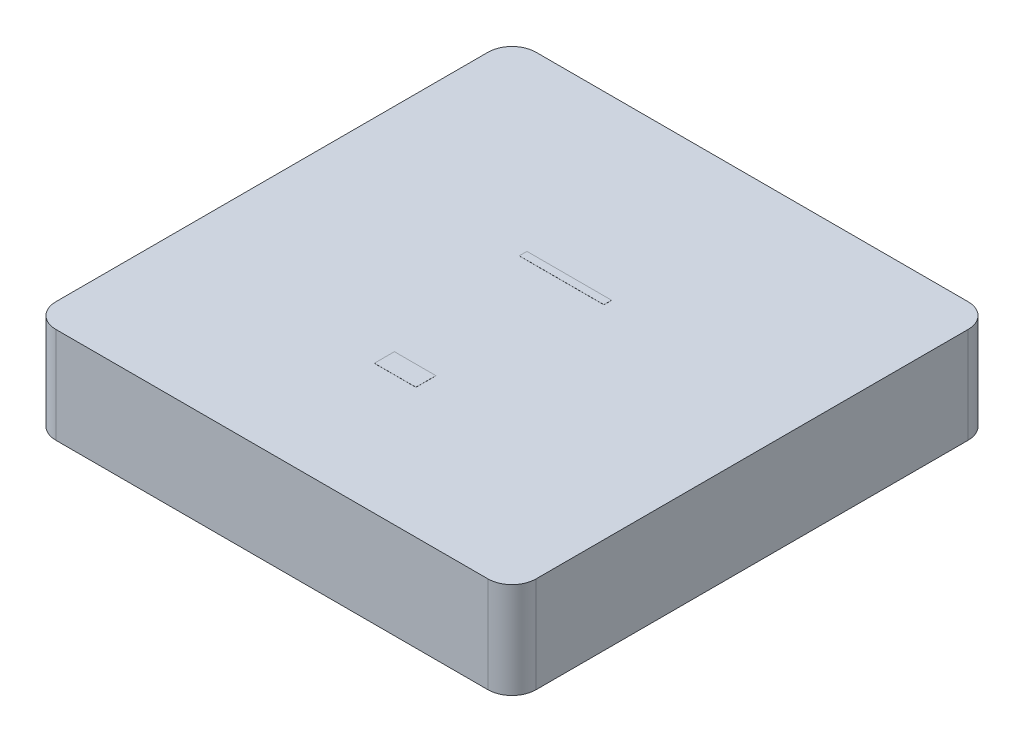
ISO-10303-21;
HEADER;
FILE_DESCRIPTION(('STEP AP214'),'2;1');
FILE_NAME('part.step','',(''),(''),'','','');
FILE_SCHEMA(('AUTOMOTIVE_DESIGN { 1 0 10303 214 1 1 1 1 }'));
ENDSEC;
DATA;
#1=APPLICATION_CONTEXT('core data for automotive mechanical design processes');
#2=APPLICATION_PROTOCOL_DEFINITION('international standard','automotive_design',2000,#1);
#3=PRODUCT_CONTEXT('',#1,'mechanical');
#4=PRODUCT('Part','Part','',(#3));
#5=PRODUCT_RELATED_PRODUCT_CATEGORY('part','',(#4));
#6=PRODUCT_DEFINITION_FORMATION('','',#4);
#7=PRODUCT_DEFINITION_CONTEXT('part definition',#1,'design');
#8=PRODUCT_DEFINITION('design','',#6,#7);
#9=PRODUCT_DEFINITION_SHAPE('','',#8);
#10=(LENGTH_UNIT() NAMED_UNIT(*) SI_UNIT(.MILLI.,.METRE.));
#11=(NAMED_UNIT(*) PLANE_ANGLE_UNIT() SI_UNIT($,.RADIAN.));
#12=(NAMED_UNIT(*) SI_UNIT($,.STERADIAN.) SOLID_ANGLE_UNIT());
#13=UNCERTAINTY_MEASURE_WITH_UNIT(LENGTH_MEASURE(1.E-05),#10,'distance_accuracy_value','');
#14=(GEOMETRIC_REPRESENTATION_CONTEXT(3) GLOBAL_UNCERTAINTY_ASSIGNED_CONTEXT((#13)) GLOBAL_UNIT_ASSIGNED_CONTEXT((#10,
#11,#12)) REPRESENTATION_CONTEXT('',''));
#15=CARTESIAN_POINT('',(0.,0.,0.));
#16=DIRECTION('',(0.,0.,1.));
#17=DIRECTION('',(1.,0.,0.));
#18=AXIS2_PLACEMENT_3D('',#15,#16,#17);
#19=CARTESIAN_POINT('',(0.,2.54,-12.7));
#20=DIRECTION('',(1.,0.,0.));
#21=DIRECTION('',(0.,0.,-1.));
#22=AXIS2_PLACEMENT_3D('',#19,#20,#21);
#23=PLANE('',#22);
#24=DIRECTION('',(0.,0.,1.));
#25=VECTOR('',#24,1.);
#26=CARTESIAN_POINT('',(0.,2.54,-12.7));
#27=LINE('',#26,#25);
#28=CARTESIAN_POINT('',(0.,2.54,-12.065));
#29=VERTEX_POINT('',#28);
#30=CARTESIAN_POINT('',(0.,2.54,-0.635));
#31=VERTEX_POINT('',#30);
#32=EDGE_CURVE('E279',#29,#31,#27,.T.);
#33=ORIENTED_EDGE('',*,*,#32,.F.);
#34=DIRECTION('',(0.,-1.,0.));
#35=VECTOR('',#34,1.);
#36=CARTESIAN_POINT('',(0.,2.54,-12.065));
#37=LINE('',#36,#35);
#38=CARTESIAN_POINT('',(0.,0.,-12.065));
#39=VERTEX_POINT('',#38);
#40=EDGE_CURVE('E304',#29,#39,#37,.T.);
#41=ORIENTED_EDGE('',*,*,#40,.T.);
#42=DIRECTION('',(0.,0.,1.));
#43=VECTOR('',#42,1.);
#44=CARTESIAN_POINT('',(0.,0.,-12.7));
#45=LINE('',#44,#43);
#46=CARTESIAN_POINT('',(0.,0.,-0.635));
#47=VERTEX_POINT('',#46);
#48=EDGE_CURVE('E259',#39,#47,#45,.T.);
#49=ORIENTED_EDGE('',*,*,#48,.T.);
#50=DIRECTION('',(0.,-1.,0.));
#51=VECTOR('',#50,1.);
#52=CARTESIAN_POINT('',(0.,2.54,-0.635));
#53=LINE('',#52,#51);
#54=EDGE_CURVE('E292',#47,#31,#53,.F.);
#55=ORIENTED_EDGE('',*,*,#54,.T.);
#56=EDGE_LOOP('',(#33,#41,#49,#55));
#57=FACE_BOUND('',#56,.T.);
#58=ADVANCED_FACE('F33',(#57),#23,.F.);
#59=CARTESIAN_POINT('',(0.,2.54,0.));
#60=DIRECTION('',(0.,0.,-1.));
#61=DIRECTION('',(-1.,0.,0.));
#62=AXIS2_PLACEMENT_3D('',#59,#60,#61);
#63=PLANE('',#62);
#64=DIRECTION('',(1.,0.,0.));
#65=VECTOR('',#64,1.);
#66=CARTESIAN_POINT('',(0.,0.,0.));
#67=LINE('',#66,#65);
#68=CARTESIAN_POINT('',(0.635,0.,0.));
#69=VERTEX_POINT('',#68);
#70=CARTESIAN_POINT('',(12.065,0.,0.));
#71=VERTEX_POINT('',#70);
#72=EDGE_CURVE('E295',#69,#71,#67,.T.);
#73=ORIENTED_EDGE('',*,*,#72,.T.);
#74=DIRECTION('',(0.,-1.,0.));
#75=VECTOR('',#74,1.);
#76=CARTESIAN_POINT('',(12.065,2.54,0.));
#77=LINE('',#76,#75);
#78=CARTESIAN_POINT('',(12.065,2.54,0.));
#79=VERTEX_POINT('',#78);
#80=EDGE_CURVE('E41',#71,#79,#77,.F.);
#81=ORIENTED_EDGE('',*,*,#80,.T.);
#82=DIRECTION('',(1.,0.,0.));
#83=VECTOR('',#82,1.);
#84=CARTESIAN_POINT('',(0.,2.54,0.));
#85=LINE('',#84,#83);
#86=CARTESIAN_POINT('',(0.635,2.54,0.));
#87=VERTEX_POINT('',#86);
#88=EDGE_CURVE('E282',#87,#79,#85,.T.);
#89=ORIENTED_EDGE('',*,*,#88,.F.);
#90=DIRECTION('',(0.,-1.,0.));
#91=VECTOR('',#90,1.);
#92=CARTESIAN_POINT('',(0.635,2.54,0.));
#93=LINE('',#92,#91);
#94=EDGE_CURVE('E333',#87,#69,#93,.T.);
#95=ORIENTED_EDGE('',*,*,#94,.T.);
#96=EDGE_LOOP('',(#73,#81,#89,#95));
#97=FACE_BOUND('',#96,.T.);
#98=ADVANCED_FACE('F338',(#97),#63,.F.);
#99=CARTESIAN_POINT('',(12.7,2.54,0.));
#100=DIRECTION('',(-1.,0.,0.));
#101=DIRECTION('',(0.,0.,1.));
#102=AXIS2_PLACEMENT_3D('',#99,#100,#101);
#103=PLANE('',#102);
#104=DIRECTION('',(0.,0.,-1.));
#105=VECTOR('',#104,1.);
#106=CARTESIAN_POINT('',(12.7,0.,0.));
#107=LINE('',#106,#105);
#108=CARTESIAN_POINT('',(12.7,0.,-0.635));
#109=VERTEX_POINT('',#108);
#110=CARTESIAN_POINT('',(12.7,0.,-12.065));
#111=VERTEX_POINT('',#110);
#112=EDGE_CURVE('E298',#109,#111,#107,.T.);
#113=ORIENTED_EDGE('',*,*,#112,.T.);
#114=DIRECTION('',(0.,-1.,0.));
#115=VECTOR('',#114,1.);
#116=CARTESIAN_POINT('',(12.7,2.54,-12.065));
#117=LINE('',#116,#115);
#118=CARTESIAN_POINT('',(12.7,2.54,-12.065));
#119=VERTEX_POINT('',#118);
#120=EDGE_CURVE('E331',#111,#119,#117,.F.);
#121=ORIENTED_EDGE('',*,*,#120,.T.);
#122=DIRECTION('',(0.,0.,-1.));
#123=VECTOR('',#122,1.);
#124=CARTESIAN_POINT('',(12.7,2.54,0.));
#125=LINE('',#124,#123);
#126=CARTESIAN_POINT('',(12.7,2.54,-0.635));
#127=VERTEX_POINT('',#126);
#128=EDGE_CURVE('E286',#127,#119,#125,.T.);
#129=ORIENTED_EDGE('',*,*,#128,.F.);
#130=DIRECTION('',(0.,-1.,0.));
#131=VECTOR('',#130,1.);
#132=CARTESIAN_POINT('',(12.7,2.54,-0.635));
#133=LINE('',#132,#131);
#134=EDGE_CURVE('E328',#127,#109,#133,.T.);
#135=ORIENTED_EDGE('',*,*,#134,.T.);
#136=EDGE_LOOP('',(#113,#121,#129,#135));
#137=FACE_BOUND('',#136,.T.);
#138=ADVANCED_FACE('F351',(#137),#103,.F.);
#139=CARTESIAN_POINT('',(12.7,2.54,-12.7));
#140=DIRECTION('',(0.,0.,1.));
#141=DIRECTION('',(1.,0.,0.));
#142=AXIS2_PLACEMENT_3D('',#139,#140,#141);
#143=PLANE('',#142);
#144=DIRECTION('',(-1.,0.,0.));
#145=VECTOR('',#144,1.);
#146=CARTESIAN_POINT('',(12.7,0.,-12.7));
#147=LINE('',#146,#145);
#148=CARTESIAN_POINT('',(12.065,0.,-12.7));
#149=VERTEX_POINT('',#148);
#150=CARTESIAN_POINT('',(0.634999999999995,0.,-12.7));
#151=VERTEX_POINT('',#150);
#152=EDGE_CURVE('E283',#149,#151,#147,.T.);
#153=ORIENTED_EDGE('',*,*,#152,.T.);
#154=DIRECTION('',(0.,-1.,0.));
#155=VECTOR('',#154,1.);
#156=CARTESIAN_POINT('',(0.634999999999995,2.54,-12.7));
#157=LINE('',#156,#155);
#158=CARTESIAN_POINT('',(0.634999999999995,2.54,-12.7));
#159=VERTEX_POINT('',#158);
#160=EDGE_CURVE('E318',#151,#159,#157,.F.);
#161=ORIENTED_EDGE('',*,*,#160,.T.);
#162=DIRECTION('',(-1.,0.,0.));
#163=VECTOR('',#162,1.);
#164=CARTESIAN_POINT('',(12.7,2.54,-12.7));
#165=LINE('',#164,#163);
#166=CARTESIAN_POINT('',(12.065,2.54,-12.7));
#167=VERTEX_POINT('',#166);
#168=EDGE_CURVE('E289',#167,#159,#165,.T.);
#169=ORIENTED_EDGE('',*,*,#168,.F.);
#170=DIRECTION('',(0.,-1.,0.));
#171=VECTOR('',#170,1.);
#172=CARTESIAN_POINT('',(12.065,2.54,-12.7));
#173=LINE('',#172,#171);
#174=EDGE_CURVE('E315',#167,#149,#173,.T.);
#175=ORIENTED_EDGE('',*,*,#174,.T.);
#176=EDGE_LOOP('',(#153,#161,#169,#175));
#177=FACE_BOUND('',#176,.T.);
#178=ADVANCED_FACE('F363',(#177),#143,.F.);
#179=CARTESIAN_POINT('',(0.,2.54,0.));
#180=DIRECTION('',(0.,1.,0.));
#181=DIRECTION('',(0.,0.,1.));
#182=AXIS2_PLACEMENT_3D('',#179,#180,#181);
#183=PLANE('',#182);
#184=DIRECTION('',(0.,0.,-1.));
#185=VECTOR('',#184,1.);
#186=CARTESIAN_POINT('',(5.07999999999999,2.54,-7.81212820512821));
#187=LINE('',#186,#185);
#188=CARTESIAN_POINT('',(5.07999999999999,2.54,-7.81212820512821));
#189=VERTEX_POINT('',#188);
#190=CARTESIAN_POINT('',(5.07999999999999,2.54,-8.01565384615385));
#191=VERTEX_POINT('',#190);
#192=EDGE_CURVE('E199',#189,#191,#187,.T.);
#193=ORIENTED_EDGE('',*,*,#192,.T.);
#194=DIRECTION('',(1.,0.,0.));
#195=VECTOR('',#194,1.);
#196=CARTESIAN_POINT('',(5.07999999999999,2.54,-8.01565384615385));
#197=LINE('',#196,#195);
#198=CARTESIAN_POINT('',(7.31878205128205,2.54,-8.01565384615385));
#199=VERTEX_POINT('',#198);
#200=EDGE_CURVE('E175',#191,#199,#197,.T.);
#201=ORIENTED_EDGE('',*,*,#200,.T.);
#202=DIRECTION('',(0.,0.,1.));
#203=VECTOR('',#202,1.);
#204=CARTESIAN_POINT('',(7.31878205128205,2.54,-8.01565384615385));
#205=LINE('',#204,#203);
#206=CARTESIAN_POINT('',(7.31878205128205,2.54,-7.81212820512821));
#207=VERTEX_POINT('',#206);
#208=EDGE_CURVE('E53',#199,#207,#205,.T.);
#209=ORIENTED_EDGE('',*,*,#208,.T.);
#210=DIRECTION('',(-1.,0.,0.));
#211=VECTOR('',#210,1.);
#212=CARTESIAN_POINT('',(7.31878205128205,2.54,-7.81212820512821));
#213=LINE('',#212,#211);
#214=EDGE_CURVE('E48',#207,#189,#213,.T.);
#215=ORIENTED_EDGE('',*,*,#214,.T.);
#216=EDGE_LOOP('',(#193,#201,#209,#215));
#217=FACE_BOUND('',#216,.T.);
#218=DIRECTION('',(0.,0.,-1.));
#219=VECTOR('',#218,1.);
#220=CARTESIAN_POINT('',(5.62414615384615,2.54,-3.43551282051282));
#221=LINE('',#220,#219);
#222=CARTESIAN_POINT('',(5.62414615384615,2.54,-3.43551282051282));
#223=VERTEX_POINT('',#222);
#224=CARTESIAN_POINT('',(5.62414615384615,2.54,-3.96467948717949));
#225=VERTEX_POINT('',#224);
#226=EDGE_CURVE('E204',#223,#225,#221,.T.);
#227=ORIENTED_EDGE('',*,*,#226,.T.);
#228=DIRECTION('',(1.,0.,0.));
#229=VECTOR('',#228,1.);
#230=CARTESIAN_POINT('',(5.62414615384615,2.54,-3.96467948717949));
#231=LINE('',#230,#229);
#232=CARTESIAN_POINT('',(6.72318461538461,2.54,-3.96467948717949));
#233=VERTEX_POINT('',#232);
#234=EDGE_CURVE('E223',#225,#233,#231,.T.);
#235=ORIENTED_EDGE('',*,*,#234,.T.);
#236=DIRECTION('',(0.,0.,1.));
#237=VECTOR('',#236,1.);
#238=CARTESIAN_POINT('',(6.72318461538461,2.54,-3.96467948717949));
#239=LINE('',#238,#237);
#240=CARTESIAN_POINT('',(6.72318461538461,2.54,-3.43551282051282));
#241=VERTEX_POINT('',#240);
#242=EDGE_CURVE('E225',#233,#241,#239,.T.);
#243=ORIENTED_EDGE('',*,*,#242,.T.);
#244=DIRECTION('',(-1.,0.,0.));
#245=VECTOR('',#244,1.);
#246=CARTESIAN_POINT('',(6.72318461538461,2.54,-3.43551282051282));
#247=LINE('',#246,#245);
#248=EDGE_CURVE('E212',#241,#223,#247,.T.);
#249=ORIENTED_EDGE('',*,*,#248,.T.);
#250=EDGE_LOOP('',(#227,#235,#243,#249));
#251=FACE_BOUND('',#250,.T.);
#252=ORIENTED_EDGE('',*,*,#168,.T.);
#253=CARTESIAN_POINT('',(0.634999999999995,2.54,-12.065));
#254=DIRECTION('',(0.,1.,0.));
#255=DIRECTION('',(0.,0.,1.));
#256=AXIS2_PLACEMENT_3D('',#253,#254,#255);
#257=CIRCLE('',#256,0.635);
#258=EDGE_CURVE('E326',#159,#29,#257,.T.);
#259=ORIENTED_EDGE('',*,*,#258,.T.);
#260=ORIENTED_EDGE('',*,*,#32,.T.);
#261=CARTESIAN_POINT('',(0.635,2.54,-0.635));
#262=DIRECTION('',(0.,1.,0.));
#263=DIRECTION('',(0.,0.,1.));
#264=AXIS2_PLACEMENT_3D('',#261,#262,#263);
#265=CIRCLE('',#264,0.635);
#266=EDGE_CURVE('E320',#31,#87,#265,.T.);
#267=ORIENTED_EDGE('',*,*,#266,.T.);
#268=ORIENTED_EDGE('',*,*,#88,.T.);
#269=CARTESIAN_POINT('',(12.065,2.54,-0.635));
#270=DIRECTION('',(0.,1.,0.));
#271=DIRECTION('',(0.,0.,1.));
#272=AXIS2_PLACEMENT_3D('',#269,#270,#271);
#273=CIRCLE('',#272,0.635);
#274=EDGE_CURVE('E322',#79,#127,#273,.T.);
#275=ORIENTED_EDGE('',*,*,#274,.T.);
#276=ORIENTED_EDGE('',*,*,#128,.T.);
#277=CARTESIAN_POINT('',(12.065,2.54,-12.065));
#278=DIRECTION('',(0.,1.,0.));
#279=DIRECTION('',(0.,0.,1.));
#280=AXIS2_PLACEMENT_3D('',#277,#278,#279);
#281=CIRCLE('',#280,0.635);
#282=EDGE_CURVE('E324',#119,#167,#281,.T.);
#283=ORIENTED_EDGE('',*,*,#282,.T.);
#284=EDGE_LOOP('',(#252,#259,#260,#267,#268,#275,#276,#283));
#285=FACE_BOUND('',#284,.T.);
#286=ADVANCED_FACE('F344',(#217,#251,#285),#183,.T.);
#287=CARTESIAN_POINT('',(0.,0.,0.));
#288=DIRECTION('',(0.,1.,0.));
#289=DIRECTION('',(0.,0.,1.));
#290=AXIS2_PLACEMENT_3D('',#287,#288,#289);
#291=PLANE('',#290);
#292=DIRECTION('',(-1.,0.,0.));
#293=VECTOR('',#292,1.);
#294=CARTESIAN_POINT('',(12.7,0.,-12.065));
#295=LINE('',#294,#293);
#296=CARTESIAN_POINT('',(12.065,0.,-12.065));
#297=VERTEX_POINT('',#296);
#298=CARTESIAN_POINT('',(0.634999999999995,0.,-12.065));
#299=VERTEX_POINT('',#298);
#300=EDGE_CURVE('E247',#297,#299,#295,.T.);
#301=ORIENTED_EDGE('',*,*,#300,.T.);
#302=DIRECTION('',(0.,0.,1.));
#303=VECTOR('',#302,1.);
#304=CARTESIAN_POINT('',(0.634999999999995,0.,-12.7));
#305=LINE('',#304,#303);
#306=CARTESIAN_POINT('',(0.635,0.,-0.635));
#307=VERTEX_POINT('',#306);
#308=EDGE_CURVE('E242',#299,#307,#305,.T.);
#309=ORIENTED_EDGE('',*,*,#308,.T.);
#310=DIRECTION('',(1.,0.,0.));
#311=VECTOR('',#310,1.);
#312=CARTESIAN_POINT('',(0.,0.,-0.635));
#313=LINE('',#312,#311);
#314=CARTESIAN_POINT('',(12.065,0.,-0.635));
#315=VERTEX_POINT('',#314);
#316=EDGE_CURVE('E271',#307,#315,#313,.T.);
#317=ORIENTED_EDGE('',*,*,#316,.T.);
#318=DIRECTION('',(0.,0.,-1.));
#319=VECTOR('',#318,1.);
#320=CARTESIAN_POINT('',(12.065,0.,0.));
#321=LINE('',#320,#319);
#322=EDGE_CURVE('E274',#315,#297,#321,.T.);
#323=ORIENTED_EDGE('',*,*,#322,.T.);
#324=EDGE_LOOP('',(#301,#309,#317,#323));
#325=FACE_BOUND('',#324,.T.);
#326=ORIENTED_EDGE('',*,*,#48,.F.);
#327=CARTESIAN_POINT('',(0.634999999999995,0.,-12.065));
#328=DIRECTION('',(0.,1.,0.));
#329=DIRECTION('',(0.,0.,1.));
#330=AXIS2_PLACEMENT_3D('',#327,#328,#329);
#331=CIRCLE('',#330,0.635);
#332=EDGE_CURVE('E313',#39,#151,#331,.F.);
#333=ORIENTED_EDGE('',*,*,#332,.T.);
#334=ORIENTED_EDGE('',*,*,#152,.F.);
#335=CARTESIAN_POINT('',(12.065,0.,-12.065));
#336=DIRECTION('',(0.,1.,0.));
#337=DIRECTION('',(0.,0.,1.));
#338=AXIS2_PLACEMENT_3D('',#335,#336,#337);
#339=CIRCLE('',#338,0.635);
#340=EDGE_CURVE('E311',#149,#111,#339,.F.);
#341=ORIENTED_EDGE('',*,*,#340,.T.);
#342=ORIENTED_EDGE('',*,*,#112,.F.);
#343=CARTESIAN_POINT('',(12.065,0.,-0.635));
#344=DIRECTION('',(0.,1.,0.));
#345=DIRECTION('',(0.,0.,1.));
#346=AXIS2_PLACEMENT_3D('',#343,#344,#345);
#347=CIRCLE('',#346,0.635);
#348=EDGE_CURVE('E309',#109,#71,#347,.F.);
#349=ORIENTED_EDGE('',*,*,#348,.T.);
#350=ORIENTED_EDGE('',*,*,#72,.F.);
#351=CARTESIAN_POINT('',(0.635,0.,-0.635));
#352=DIRECTION('',(0.,1.,0.));
#353=DIRECTION('',(0.,0.,1.));
#354=AXIS2_PLACEMENT_3D('',#351,#352,#353);
#355=CIRCLE('',#354,0.635);
#356=EDGE_CURVE('E307',#69,#47,#355,.F.);
#357=ORIENTED_EDGE('',*,*,#356,.T.);
#358=EDGE_LOOP('',(#326,#333,#334,#341,#342,#349,#350,#357));
#359=FACE_BOUND('',#358,.T.);
#360=ADVANCED_FACE('F355',(#325,#359),#291,.F.);
#361=CARTESIAN_POINT('',(0.634999999999995,2.54,-12.065));
#362=DIRECTION('',(0.,-1.,0.));
#363=DIRECTION('',(0.,0.,-1.));
#364=AXIS2_PLACEMENT_3D('',#361,#362,#363);
#365=CYLINDRICAL_SURFACE('',#364,0.635);
#366=ORIENTED_EDGE('',*,*,#258,.F.);
#367=ORIENTED_EDGE('',*,*,#160,.F.);
#368=ORIENTED_EDGE('',*,*,#332,.F.);
#369=ORIENTED_EDGE('',*,*,#40,.F.);
#370=EDGE_LOOP('',(#366,#367,#368,#369));
#371=FACE_BOUND('',#370,.T.);
#372=ADVANCED_FACE('F369',(#371),#365,.T.);
#373=CARTESIAN_POINT('',(12.065,2.54,-12.065));
#374=DIRECTION('',(0.,-1.,0.));
#375=DIRECTION('',(0.,0.,-1.));
#376=AXIS2_PLACEMENT_3D('',#373,#374,#375);
#377=CYLINDRICAL_SURFACE('',#376,0.635);
#378=ORIENTED_EDGE('',*,*,#282,.F.);
#379=ORIENTED_EDGE('',*,*,#120,.F.);
#380=ORIENTED_EDGE('',*,*,#340,.F.);
#381=ORIENTED_EDGE('',*,*,#174,.F.);
#382=EDGE_LOOP('',(#378,#379,#380,#381));
#383=FACE_BOUND('',#382,.T.);
#384=ADVANCED_FACE('F360',(#383),#377,.T.);
#385=CARTESIAN_POINT('',(12.065,2.54,-0.635));
#386=DIRECTION('',(0.,-1.,0.));
#387=DIRECTION('',(0.,0.,-1.));
#388=AXIS2_PLACEMENT_3D('',#385,#386,#387);
#389=CYLINDRICAL_SURFACE('',#388,0.635);
#390=ORIENTED_EDGE('',*,*,#274,.F.);
#391=ORIENTED_EDGE('',*,*,#80,.F.);
#392=ORIENTED_EDGE('',*,*,#348,.F.);
#393=ORIENTED_EDGE('',*,*,#134,.F.);
#394=EDGE_LOOP('',(#390,#391,#392,#393));
#395=FACE_BOUND('',#394,.T.);
#396=ADVANCED_FACE('F348',(#395),#389,.T.);
#397=CARTESIAN_POINT('',(0.635,2.54,-0.635));
#398=DIRECTION('',(0.,-1.,0.));
#399=DIRECTION('',(0.,0.,-1.));
#400=AXIS2_PLACEMENT_3D('',#397,#398,#399);
#401=CYLINDRICAL_SURFACE('',#400,0.635);
#402=ORIENTED_EDGE('',*,*,#266,.F.);
#403=ORIENTED_EDGE('',*,*,#54,.F.);
#404=ORIENTED_EDGE('',*,*,#356,.F.);
#405=ORIENTED_EDGE('',*,*,#94,.F.);
#406=EDGE_LOOP('',(#402,#403,#404,#405));
#407=FACE_BOUND('',#406,.T.);
#408=ADVANCED_FACE('F35',(#407),#401,.T.);
#409=CARTESIAN_POINT('',(0.634999999999995,2.54,-12.7));
#410=DIRECTION('',(1.,0.,0.));
#411=DIRECTION('',(0.,0.,-1.));
#412=AXIS2_PLACEMENT_3D('',#409,#410,#411);
#413=PLANE('',#412);
#414=DIRECTION('',(0.,0.,1.));
#415=VECTOR('',#414,1.);
#416=CARTESIAN_POINT('',(0.634999999999995,1.905,-12.7));
#417=LINE('',#416,#415);
#418=CARTESIAN_POINT('',(0.634999999999995,1.905,-12.065));
#419=VERTEX_POINT('',#418);
#420=CARTESIAN_POINT('',(0.635,1.905,-0.635));
#421=VERTEX_POINT('',#420);
#422=EDGE_CURVE('E243',#419,#421,#417,.T.);
#423=ORIENTED_EDGE('',*,*,#422,.T.);
#424=DIRECTION('',(0.,1.,0.));
#425=VECTOR('',#424,1.);
#426=CARTESIAN_POINT('',(0.635,2.54,-0.635));
#427=LINE('',#426,#425);
#428=EDGE_CURVE('E252',#307,#421,#427,.T.);
#429=ORIENTED_EDGE('',*,*,#428,.F.);
#430=ORIENTED_EDGE('',*,*,#308,.F.);
#431=DIRECTION('',(0.,1.,0.));
#432=VECTOR('',#431,1.);
#433=CARTESIAN_POINT('',(0.634999999999995,2.54,-12.065));
#434=LINE('',#433,#432);
#435=EDGE_CURVE('E248',#299,#419,#434,.T.);
#436=ORIENTED_EDGE('',*,*,#435,.T.);
#437=EDGE_LOOP('',(#423,#429,#430,#436));
#438=FACE_BOUND('',#437,.T.);
#439=ADVANCED_FACE('F374',(#438),#413,.T.);
#440=CARTESIAN_POINT('',(0.,2.54,-0.635));
#441=DIRECTION('',(0.,0.,-1.));
#442=DIRECTION('',(-1.,0.,0.));
#443=AXIS2_PLACEMENT_3D('',#440,#441,#442);
#444=PLANE('',#443);
#445=ORIENTED_EDGE('',*,*,#316,.F.);
#446=ORIENTED_EDGE('',*,*,#428,.T.);
#447=DIRECTION('',(1.,0.,0.));
#448=VECTOR('',#447,1.);
#449=CARTESIAN_POINT('',(0.,1.905,-0.635));
#450=LINE('',#449,#448);
#451=CARTESIAN_POINT('',(12.065,1.905,-0.635));
#452=VERTEX_POINT('',#451);
#453=EDGE_CURVE('E246',#421,#452,#450,.T.);
#454=ORIENTED_EDGE('',*,*,#453,.T.);
#455=DIRECTION('',(0.,1.,0.));
#456=VECTOR('',#455,1.);
#457=CARTESIAN_POINT('',(12.065,2.54,-0.635));
#458=LINE('',#457,#456);
#459=EDGE_CURVE('E256',#315,#452,#458,.T.);
#460=ORIENTED_EDGE('',*,*,#459,.F.);
#461=EDGE_LOOP('',(#445,#446,#454,#460));
#462=FACE_BOUND('',#461,.T.);
#463=ADVANCED_FACE('F379',(#462),#444,.T.);
#464=CARTESIAN_POINT('',(12.065,2.54,0.));
#465=DIRECTION('',(-1.,0.,0.));
#466=DIRECTION('',(0.,0.,1.));
#467=AXIS2_PLACEMENT_3D('',#464,#465,#466);
#468=PLANE('',#467);
#469=ORIENTED_EDGE('',*,*,#322,.F.);
#470=ORIENTED_EDGE('',*,*,#459,.T.);
#471=DIRECTION('',(0.,0.,-1.));
#472=VECTOR('',#471,1.);
#473=CARTESIAN_POINT('',(12.065,1.905,0.));
#474=LINE('',#473,#472);
#475=CARTESIAN_POINT('',(12.065,1.905,-12.065));
#476=VERTEX_POINT('',#475);
#477=EDGE_CURVE('E262',#452,#476,#474,.T.);
#478=ORIENTED_EDGE('',*,*,#477,.T.);
#479=DIRECTION('',(0.,1.,0.));
#480=VECTOR('',#479,1.);
#481=CARTESIAN_POINT('',(12.065,2.54,-12.065));
#482=LINE('',#481,#480);
#483=EDGE_CURVE('E251',#297,#476,#482,.T.);
#484=ORIENTED_EDGE('',*,*,#483,.F.);
#485=EDGE_LOOP('',(#469,#470,#478,#484));
#486=FACE_BOUND('',#485,.T.);
#487=ADVANCED_FACE('F432',(#486),#468,.T.);
#488=CARTESIAN_POINT('',(12.7,2.54,-12.065));
#489=DIRECTION('',(0.,0.,1.));
#490=DIRECTION('',(1.,0.,0.));
#491=AXIS2_PLACEMENT_3D('',#488,#489,#490);
#492=PLANE('',#491);
#493=ORIENTED_EDGE('',*,*,#300,.F.);
#494=ORIENTED_EDGE('',*,*,#483,.T.);
#495=DIRECTION('',(-1.,0.,0.));
#496=VECTOR('',#495,1.);
#497=CARTESIAN_POINT('',(12.7,1.905,-12.065));
#498=LINE('',#497,#496);
#499=EDGE_CURVE('E255',#476,#419,#498,.T.);
#500=ORIENTED_EDGE('',*,*,#499,.T.);
#501=ORIENTED_EDGE('',*,*,#435,.F.);
#502=EDGE_LOOP('',(#493,#494,#500,#501));
#503=FACE_BOUND('',#502,.T.);
#504=ADVANCED_FACE('F442',(#503),#492,.T.);
#505=CARTESIAN_POINT('',(0.,1.905,0.));
#506=DIRECTION('',(0.,1.,0.));
#507=DIRECTION('',(0.,0.,1.));
#508=AXIS2_PLACEMENT_3D('',#505,#506,#507);
#509=PLANE('',#508);
#510=CARTESIAN_POINT('',(6.34999999999999,1.905,-6.35));
#511=DIRECTION('',(0.,1.,0.));
#512=DIRECTION('',(0.,0.,1.));
#513=AXIS2_PLACEMENT_3D('',#510,#511,#512);
#514=CIRCLE('',#513,2.54);
#515=CARTESIAN_POINT('',(6.34999999999999,1.905,-3.81));
#516=VERTEX_POINT('',#515);
#517=EDGE_CURVE('E11',#516,#516,#514,.F.);
#518=ORIENTED_EDGE('',*,*,#517,.F.);
#519=EDGE_LOOP('',(#518));
#520=FACE_BOUND('',#519,.T.);
#521=ORIENTED_EDGE('',*,*,#499,.F.);
#522=ORIENTED_EDGE('',*,*,#477,.F.);
#523=ORIENTED_EDGE('',*,*,#453,.F.);
#524=ORIENTED_EDGE('',*,*,#422,.F.);
#525=EDGE_LOOP('',(#521,#522,#523,#524));
#526=FACE_BOUND('',#525,.T.);
#527=ADVANCED_FACE('F452',(#520,#526),#509,.F.);
#528=CARTESIAN_POINT('',(6.34999999999999,-7.18420489685532,-6.35));
#529=DIRECTION('',(0.,1.,0.));
#530=DIRECTION('',(0.,0.,1.));
#531=AXIS2_PLACEMENT_3D('',#528,#529,#530);
#532=CYLINDRICAL_SURFACE('',#531,2.54);
#533=CARTESIAN_POINT('',(6.34999999999999,0.,-6.35));
#534=DIRECTION('',(0.,1.,0.));
#535=DIRECTION('',(0.,0.,1.));
#536=AXIS2_PLACEMENT_3D('',#533,#534,#535);
#537=CIRCLE('',#536,2.54);
#538=CARTESIAN_POINT('',(6.34999999999999,0.,-3.81));
#539=VERTEX_POINT('',#538);
#540=EDGE_CURVE('E231',#539,#539,#537,.T.);
#541=CARTESIAN_POINT('',(6.34999999999999,0.,-3.81));
#542=CARTESIAN_POINT('',(6.34999999999999,0.0198437499999991,-3.81));
#543=CARTESIAN_POINT('',(6.34999999999999,0.0396874999999989,-3.81));
#544=CARTESIAN_POINT('',(6.34999999999999,0.079374999999999,-3.81));
#545=CARTESIAN_POINT('',(6.34999999999999,0.0992187499999992,-3.81));
#546=CARTESIAN_POINT('',(6.34999999999999,0.138906249999999,-3.81));
#547=CARTESIAN_POINT('',(6.34999999999999,0.158749999999999,-3.81));
#548=CARTESIAN_POINT('',(6.34999999999999,0.198437499999999,-3.81));
#549=CARTESIAN_POINT('',(6.34999999999999,0.218281249999999,-3.81));
#550=CARTESIAN_POINT('',(6.34999999999999,0.25796875,-3.81));
#551=CARTESIAN_POINT('',(6.34999999999999,0.277812499999999,-3.81));
#552=CARTESIAN_POINT('',(6.34999999999999,0.317499999999999,-3.81));
#553=CARTESIAN_POINT('',(6.34999999999999,0.337343749999999,-3.81));
#554=CARTESIAN_POINT('',(6.34999999999999,0.377031249999999,-3.81));
#555=CARTESIAN_POINT('',(6.34999999999999,0.396874999999999,-3.81));
#556=CARTESIAN_POINT('',(6.34999999999999,0.436562499999999,-3.81));
#557=CARTESIAN_POINT('',(6.34999999999999,0.456406249999999,-3.81));
#558=CARTESIAN_POINT('',(6.34999999999999,0.496093749999999,-3.81));
#559=CARTESIAN_POINT('',(6.34999999999999,0.515937499999999,-3.81));
#560=CARTESIAN_POINT('',(6.34999999999999,0.555624999999999,-3.81));
#561=CARTESIAN_POINT('',(6.34999999999999,0.575468749999999,-3.81));
#562=CARTESIAN_POINT('',(6.34999999999999,0.615156249999999,-3.81));
#563=CARTESIAN_POINT('',(6.34999999999999,0.634999999999999,-3.81));
#564=CARTESIAN_POINT('',(6.34999999999999,0.674687499999998,-3.81));
#565=CARTESIAN_POINT('',(6.34999999999999,0.694531249999998,-3.81));
#566=CARTESIAN_POINT('',(6.34999999999999,0.734218749999998,-3.81));
#567=CARTESIAN_POINT('',(6.34999999999999,0.754062499999998,-3.81));
#568=CARTESIAN_POINT('',(6.34999999999999,0.793749999999998,-3.81));
#569=CARTESIAN_POINT('',(6.34999999999999,0.813593749999999,-3.81));
#570=CARTESIAN_POINT('',(6.34999999999999,0.853281249999999,-3.81));
#571=CARTESIAN_POINT('',(6.34999999999999,0.873124999999999,-3.81));
#572=CARTESIAN_POINT('',(6.34999999999999,0.912812499999999,-3.81));
#573=CARTESIAN_POINT('',(6.34999999999999,0.932656249999999,-3.81));
#574=CARTESIAN_POINT('',(6.34999999999999,0.972343749999998,-3.81));
#575=CARTESIAN_POINT('',(6.34999999999999,0.992187499999998,-3.81));
#576=CARTESIAN_POINT('',(6.34999999999999,1.031875,-3.81));
#577=CARTESIAN_POINT('',(6.34999999999999,1.05171875,-3.81));
#578=CARTESIAN_POINT('',(6.34999999999999,1.09140625,-3.81));
#579=CARTESIAN_POINT('',(6.34999999999999,1.11125,-3.81));
#580=CARTESIAN_POINT('',(6.34999999999999,1.1509375,-3.81));
#581=CARTESIAN_POINT('',(6.34999999999999,1.17078125,-3.81));
#582=CARTESIAN_POINT('',(6.34999999999999,1.21046875,-3.81));
#583=CARTESIAN_POINT('',(6.34999999999999,1.2303125,-3.81));
#584=CARTESIAN_POINT('',(6.34999999999999,1.27,-3.81));
#585=CARTESIAN_POINT('',(6.34999999999999,1.28984375,-3.81));
#586=CARTESIAN_POINT('',(6.34999999999999,1.32953125,-3.81));
#587=CARTESIAN_POINT('',(6.34999999999999,1.349375,-3.81));
#588=CARTESIAN_POINT('',(6.34999999999999,1.3890625,-3.81));
#589=CARTESIAN_POINT('',(6.34999999999999,1.40890625,-3.81));
#590=CARTESIAN_POINT('',(6.34999999999999,1.44859375,-3.81));
#591=CARTESIAN_POINT('',(6.34999999999999,1.4684375,-3.81));
#592=CARTESIAN_POINT('',(6.34999999999999,1.508125,-3.81));
#593=CARTESIAN_POINT('',(6.34999999999999,1.52796875,-3.81));
#594=CARTESIAN_POINT('',(6.34999999999999,1.56765625,-3.81));
#595=CARTESIAN_POINT('',(6.34999999999999,1.5875,-3.81));
#596=CARTESIAN_POINT('',(6.34999999999999,1.6271875,-3.81));
#597=CARTESIAN_POINT('',(6.34999999999999,1.64703125,-3.81));
#598=CARTESIAN_POINT('',(6.34999999999999,1.68671875,-3.81));
#599=CARTESIAN_POINT('',(6.34999999999999,1.7065625,-3.81));
#600=CARTESIAN_POINT('',(6.34999999999999,1.74625,-3.81));
#601=CARTESIAN_POINT('',(6.34999999999999,1.76609375,-3.81));
#602=CARTESIAN_POINT('',(6.34999999999999,1.80578125,-3.81));
#603=CARTESIAN_POINT('',(6.34999999999999,1.825625,-3.81));
#604=CARTESIAN_POINT('',(6.34999999999999,1.8653125,-3.81));
#605=CARTESIAN_POINT('',(6.34999999999999,1.88515625,-3.81));
#606=CARTESIAN_POINT('',(6.34999999999999,1.905,-3.81));
#607=B_SPLINE_CURVE_WITH_KNOTS('',3,(#541,#542,#543,#544,#545,#546,#547,#548,#549,#550,#551,
#552,#553,#554,#555,#556,#557,#558,#559,#560,#561,#562,#563,#564,#565,#566,#567,#568,#569,#570,
#571,#572,#573,#574,#575,#576,#577,#578,#579,#580,#581,#582,#583,#584,#585,#586,#587,#588,#589,
#590,#591,#592,#593,#594,#595,#596,#597,#598,#599,#600,#601,#602,#603,#604,#605,#606),
.UNSPECIFIED.,.F.,.F.,(4,2,2,2,2,2,2,2,2,2,2,2,2,2,2,2,2,2,2,2,2,2,2,2,2,2,2,2,2,2,2,2,4),(0.,
0.0595312499999997,0.1190625,0.17859375,0.238125,0.29765625,0.3571875,0.41671875,0.47625,
0.53578125,0.5953125,0.654843749999999,0.714374999999999,0.773906249999999,0.8334375,0.89296875,
0.952499999999999,1.01203125,1.0715625,1.13109375,1.190625,1.25015625,1.3096875,1.36921875,
1.42875,1.48828125,1.5478125,1.60734375,1.666875,1.72640625,1.7859375,1.84546875,1.905),.UNSPECIFIED.);
#608=EDGE_CURVE('BSEAM462',#539,#516,#607,.T.);
#609=ORIENTED_EDGE('',*,*,#540,.T.);
#610=ORIENTED_EDGE('',*,*,#517,.T.);
#611=ORIENTED_EDGE('',*,*,#608,.T.);
#612=ORIENTED_EDGE('',*,*,#608,.F.);
#613=EDGE_LOOP('',(#609,#611,#610,#612));
#614=FACE_BOUND('',#613,.T.);
#615=ADVANCED_FACE('F462',(#614),#532,.T.);
#616=CARTESIAN_POINT('',(0.,0.,0.));
#617=DIRECTION('',(0.,1.,0.));
#618=DIRECTION('',(0.,0.,1.));
#619=AXIS2_PLACEMENT_3D('',#616,#617,#618);
#620=PLANE('',#619);
#621=ORIENTED_EDGE('',*,*,#540,.F.);
#622=EDGE_LOOP('',(#621));
#623=FACE_BOUND('',#622,.T.);
#624=ADVANCED_FACE('F472',(#623),#620,.F.);
#625=CARTESIAN_POINT('',(5.62414615384615,2.54254,-3.43551282051282));
#626=DIRECTION('',(-1.,0.,0.));
#627=DIRECTION('',(0.,0.,1.));
#628=AXIS2_PLACEMENT_3D('',#625,#626,#627);
#629=PLANE('',#628);
#630=ORIENTED_EDGE('',*,*,#226,.F.);
#631=DIRECTION('',(0.,-1.,0.));
#632=VECTOR('',#631,1.);
#633=CARTESIAN_POINT('',(5.62414615384615,2.54254,-3.43551282051282));
#634=LINE('',#633,#632);
#635=CARTESIAN_POINT('',(5.62414615384615,2.54254,-3.43551282051282));
#636=VERTEX_POINT('',#635);
#637=EDGE_CURVE('E228',#636,#223,#634,.T.);
#638=ORIENTED_EDGE('',*,*,#637,.F.);
#639=DIRECTION('',(0.,0.,-1.));
#640=VECTOR('',#639,1.);
#641=CARTESIAN_POINT('',(5.62414615384615,2.54254,-3.43551282051282));
#642=LINE('',#641,#640);
#643=CARTESIAN_POINT('',(5.62414615384615,2.54254,-3.96467948717949));
#644=VERTEX_POINT('',#643);
#645=EDGE_CURVE('E208',#636,#644,#642,.T.);
#646=ORIENTED_EDGE('',*,*,#645,.T.);
#647=DIRECTION('',(0.,-1.,0.));
#648=VECTOR('',#647,1.);
#649=CARTESIAN_POINT('',(5.62414615384615,2.54254,-3.96467948717949));
#650=LINE('',#649,#648);
#651=EDGE_CURVE('E221',#644,#225,#650,.T.);
#652=ORIENTED_EDGE('',*,*,#651,.T.);
#653=EDGE_LOOP('',(#630,#638,#646,#652));
#654=FACE_BOUND('',#653,.T.);
#655=ADVANCED_FACE('F482',(#654),#629,.T.);
#656=CARTESIAN_POINT('',(6.72318461538461,2.54254,-3.43551282051282));
#657=DIRECTION('',(0.,0.,1.));
#658=DIRECTION('',(1.,0.,0.));
#659=AXIS2_PLACEMENT_3D('',#656,#657,#658);
#660=PLANE('',#659);
#661=ORIENTED_EDGE('',*,*,#248,.F.);
#662=DIRECTION('',(0.,-1.,0.));
#663=VECTOR('',#662,1.);
#664=CARTESIAN_POINT('',(6.72318461538461,2.54254,-3.43551282051282));
#665=LINE('',#664,#663);
#666=CARTESIAN_POINT('',(6.72318461538461,2.54254,-3.43551282051282));
#667=VERTEX_POINT('',#666);
#668=EDGE_CURVE('E232',#667,#241,#665,.T.);
#669=ORIENTED_EDGE('',*,*,#668,.F.);
#670=DIRECTION('',(-1.,0.,0.));
#671=VECTOR('',#670,1.);
#672=CARTESIAN_POINT('',(6.72318461538461,2.54254,-3.43551282051282));
#673=LINE('',#672,#671);
#674=EDGE_CURVE('E218',#667,#636,#673,.T.);
#675=ORIENTED_EDGE('',*,*,#674,.T.);
#676=ORIENTED_EDGE('',*,*,#637,.T.);
#677=EDGE_LOOP('',(#661,#669,#675,#676));
#678=FACE_BOUND('',#677,.T.);
#679=ADVANCED_FACE('F500',(#678),#660,.T.);
#680=CARTESIAN_POINT('',(6.72318461538461,2.54254,-3.96467948717949));
#681=DIRECTION('',(1.,0.,0.));
#682=DIRECTION('',(0.,0.,-1.));
#683=AXIS2_PLACEMENT_3D('',#680,#681,#682);
#684=PLANE('',#683);
#685=ORIENTED_EDGE('',*,*,#242,.F.);
#686=DIRECTION('',(0.,-1.,0.));
#687=VECTOR('',#686,1.);
#688=CARTESIAN_POINT('',(6.72318461538461,2.54254,-3.96467948717949));
#689=LINE('',#688,#687);
#690=CARTESIAN_POINT('',(6.72318461538461,2.54254,-3.96467948717949));
#691=VERTEX_POINT('',#690);
#692=EDGE_CURVE('E235',#691,#233,#689,.T.);
#693=ORIENTED_EDGE('',*,*,#692,.F.);
#694=DIRECTION('',(0.,0.,1.));
#695=VECTOR('',#694,1.);
#696=CARTESIAN_POINT('',(6.72318461538461,2.54254,-3.96467948717949));
#697=LINE('',#696,#695);
#698=EDGE_CURVE('E215',#691,#667,#697,.T.);
#699=ORIENTED_EDGE('',*,*,#698,.T.);
#700=ORIENTED_EDGE('',*,*,#668,.T.);
#701=EDGE_LOOP('',(#685,#693,#699,#700));
#702=FACE_BOUND('',#701,.T.);
#703=ADVANCED_FACE('F510',(#702),#684,.T.);
#704=CARTESIAN_POINT('',(5.62414615384615,2.54254,-3.96467948717949));
#705=DIRECTION('',(0.,0.,-1.));
#706=DIRECTION('',(-1.,0.,0.));
#707=AXIS2_PLACEMENT_3D('',#704,#705,#706);
#708=PLANE('',#707);
#709=ORIENTED_EDGE('',*,*,#234,.F.);
#710=ORIENTED_EDGE('',*,*,#651,.F.);
#711=DIRECTION('',(1.,0.,0.));
#712=VECTOR('',#711,1.);
#713=CARTESIAN_POINT('',(5.62414615384615,2.54254,-3.96467948717949));
#714=LINE('',#713,#712);
#715=EDGE_CURVE('E211',#644,#691,#714,.T.);
#716=ORIENTED_EDGE('',*,*,#715,.T.);
#717=ORIENTED_EDGE('',*,*,#692,.T.);
#718=EDGE_LOOP('',(#709,#710,#716,#717));
#719=FACE_BOUND('',#718,.T.);
#720=ADVANCED_FACE('F520',(#719),#708,.T.);
#721=CARTESIAN_POINT('',(0.,2.54254,0.));
#722=DIRECTION('',(0.,-1.,0.));
#723=DIRECTION('',(0.,0.,-1.));
#724=AXIS2_PLACEMENT_3D('',#721,#722,#723);
#725=PLANE('',#724);
#726=ORIENTED_EDGE('',*,*,#645,.F.);
#727=ORIENTED_EDGE('',*,*,#674,.F.);
#728=ORIENTED_EDGE('',*,*,#698,.F.);
#729=ORIENTED_EDGE('',*,*,#715,.F.);
#730=EDGE_LOOP('',(#726,#727,#728,#729));
#731=FACE_BOUND('',#730,.T.);
#732=ADVANCED_FACE('F530',(#731),#725,.F.);
#733=CARTESIAN_POINT('',(5.07999999999999,2.54254,-7.81212820512821));
#734=DIRECTION('',(-1.,0.,0.));
#735=DIRECTION('',(0.,0.,1.));
#736=AXIS2_PLACEMENT_3D('',#733,#734,#735);
#737=PLANE('',#736);
#738=ORIENTED_EDGE('',*,*,#192,.F.);
#739=DIRECTION('',(0.,-1.,0.));
#740=VECTOR('',#739,1.);
#741=CARTESIAN_POINT('',(5.07999999999999,2.54254,-7.81212820512821));
#742=LINE('',#741,#740);
#743=CARTESIAN_POINT('',(5.07999999999999,2.54254,-7.81212820512821));
#744=VERTEX_POINT('',#743);
#745=EDGE_CURVE('E193',#744,#189,#742,.T.);
#746=ORIENTED_EDGE('',*,*,#745,.F.);
#747=DIRECTION('',(0.,0.,-1.));
#748=VECTOR('',#747,1.);
#749=CARTESIAN_POINT('',(5.07999999999999,2.54254,-7.81212820512821));
#750=LINE('',#749,#748);
#751=CARTESIAN_POINT('',(5.07999999999999,2.54254,-8.01565384615385));
#752=VERTEX_POINT('',#751);
#753=EDGE_CURVE('E187',#744,#752,#750,.T.);
#754=ORIENTED_EDGE('',*,*,#753,.T.);
#755=DIRECTION('',(0.,-1.,0.));
#756=VECTOR('',#755,1.);
#757=CARTESIAN_POINT('',(5.07999999999999,2.54254,-8.01565384615385));
#758=LINE('',#757,#756);
#759=EDGE_CURVE('E170',#752,#191,#758,.T.);
#760=ORIENTED_EDGE('',*,*,#759,.T.);
#761=EDGE_LOOP('',(#738,#746,#754,#760));
#762=FACE_BOUND('',#761,.T.);
#763=ADVANCED_FACE('F192',(#762),#737,.T.);
#764=CARTESIAN_POINT('',(7.31878205128205,2.54254,-7.81212820512821));
#765=DIRECTION('',(0.,0.,1.));
#766=DIRECTION('',(1.,0.,0.));
#767=AXIS2_PLACEMENT_3D('',#764,#765,#766);
#768=PLANE('',#767);
#769=ORIENTED_EDGE('',*,*,#214,.F.);
#770=DIRECTION('',(0.,-1.,0.));
#771=VECTOR('',#770,1.);
#772=CARTESIAN_POINT('',(7.31878205128205,2.54254,-7.81212820512821));
#773=LINE('',#772,#771);
#774=CARTESIAN_POINT('',(7.31878205128205,2.54254,-7.81212820512821));
#775=VERTEX_POINT('',#774);
#776=EDGE_CURVE('E205',#775,#207,#773,.T.);
#777=ORIENTED_EDGE('',*,*,#776,.F.);
#778=DIRECTION('',(-1.,0.,0.));
#779=VECTOR('',#778,1.);
#780=CARTESIAN_POINT('',(7.31878205128205,2.54254,-7.81212820512821));
#781=LINE('',#780,#779);
#782=EDGE_CURVE('E180',#775,#744,#781,.T.);
#783=ORIENTED_EDGE('',*,*,#782,.T.);
#784=ORIENTED_EDGE('',*,*,#745,.T.);
#785=EDGE_LOOP('',(#769,#777,#783,#784));
#786=FACE_BOUND('',#785,.T.);
#787=ADVANCED_FACE('F551',(#786),#768,.T.);
#788=CARTESIAN_POINT('',(7.31878205128205,2.54254,-8.01565384615385));
#789=DIRECTION('',(1.,0.,0.));
#790=DIRECTION('',(0.,0.,-1.));
#791=AXIS2_PLACEMENT_3D('',#788,#789,#790);
#792=PLANE('',#791);
#793=ORIENTED_EDGE('',*,*,#208,.F.);
#794=DIRECTION('',(0.,-1.,0.));
#795=VECTOR('',#794,1.);
#796=CARTESIAN_POINT('',(7.31878205128205,2.54254,-8.01565384615385));
#797=LINE('',#796,#795);
#798=CARTESIAN_POINT('',(7.31878205128205,2.54254,-8.01565384615385));
#799=VERTEX_POINT('',#798);
#800=EDGE_CURVE('E179',#799,#199,#797,.T.);
#801=ORIENTED_EDGE('',*,*,#800,.F.);
#802=DIRECTION('',(0.,0.,1.));
#803=VECTOR('',#802,1.);
#804=CARTESIAN_POINT('',(7.31878205128205,2.54254,-8.01565384615385));
#805=LINE('',#804,#803);
#806=EDGE_CURVE('E190',#799,#775,#805,.T.);
#807=ORIENTED_EDGE('',*,*,#806,.T.);
#808=ORIENTED_EDGE('',*,*,#776,.T.);
#809=EDGE_LOOP('',(#793,#801,#807,#808));
#810=FACE_BOUND('',#809,.T.);
#811=ADVANCED_FACE('F560',(#810),#792,.T.);
#812=CARTESIAN_POINT('',(5.07999999999999,2.54254,-8.01565384615385));
#813=DIRECTION('',(0.,0.,-1.));
#814=DIRECTION('',(-1.,0.,0.));
#815=AXIS2_PLACEMENT_3D('',#812,#813,#814);
#816=PLANE('',#815);
#817=ORIENTED_EDGE('',*,*,#200,.F.);
#818=ORIENTED_EDGE('',*,*,#759,.F.);
#819=DIRECTION('',(1.,0.,0.));
#820=VECTOR('',#819,1.);
#821=CARTESIAN_POINT('',(5.07999999999999,2.54254,-8.01565384615385));
#822=LINE('',#821,#820);
#823=EDGE_CURVE('E174',#752,#799,#822,.T.);
#824=ORIENTED_EDGE('',*,*,#823,.T.);
#825=ORIENTED_EDGE('',*,*,#800,.T.);
#826=EDGE_LOOP('',(#817,#818,#824,#825));
#827=FACE_BOUND('',#826,.T.);
#828=ADVANCED_FACE('F172',(#827),#816,.T.);
#829=CARTESIAN_POINT('',(0.,2.54254,0.));
#830=DIRECTION('',(0.,-1.,0.));
#831=DIRECTION('',(0.,0.,-1.));
#832=AXIS2_PLACEMENT_3D('',#829,#830,#831);
#833=PLANE('',#832);
#834=ORIENTED_EDGE('',*,*,#753,.F.);
#835=ORIENTED_EDGE('',*,*,#782,.F.);
#836=ORIENTED_EDGE('',*,*,#806,.F.);
#837=ORIENTED_EDGE('',*,*,#823,.F.);
#838=EDGE_LOOP('',(#834,#835,#836,#837));
#839=FACE_BOUND('',#838,.T.);
#840=ADVANCED_FACE('F185',(#839),#833,.F.);
#841=CLOSED_SHELL('',(#58,#98,#138,#178,#286,#360,#372,#384,#396,#408,#439,#463,#487,#504,#527,
#615,#624,#655,#679,#703,#720,#732,#763,#787,#811,#828,#840));
#842=MANIFOLD_SOLID_BREP('B2',#841);
#843=ADVANCED_BREP_SHAPE_REPRESENTATION('',(#18,#842),#14);
#844=SHAPE_DEFINITION_REPRESENTATION(#9,#843);
ENDSEC;
END-ISO-10303-21;
